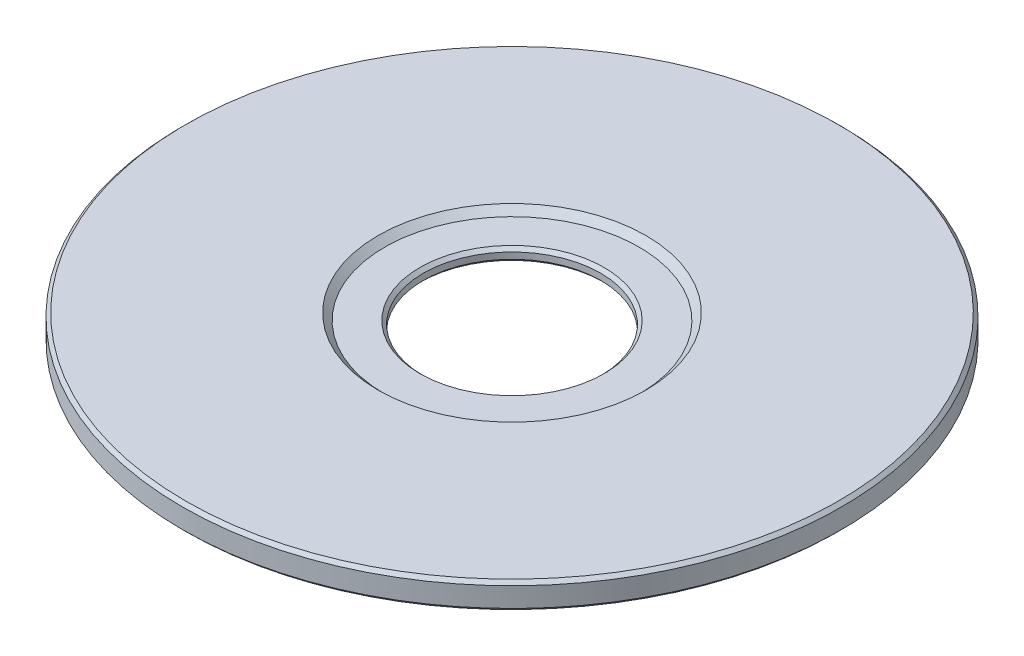
ISO-10303-21;
HEADER;
FILE_DESCRIPTION(('STEP AP214'),'2;1');
FILE_NAME('part.step','',(''),(''),'','','');
FILE_SCHEMA(('AUTOMOTIVE_DESIGN { 1 0 10303 214 1 1 1 1 }'));
ENDSEC;
DATA;
#1=APPLICATION_CONTEXT('core data for automotive mechanical design processes');
#2=APPLICATION_PROTOCOL_DEFINITION('international standard','automotive_design',2000,#1);
#3=PRODUCT_CONTEXT('',#1,'mechanical');
#4=PRODUCT('Part','Part','',(#3));
#5=PRODUCT_RELATED_PRODUCT_CATEGORY('part','',(#4));
#6=PRODUCT_DEFINITION_FORMATION('','',#4);
#7=PRODUCT_DEFINITION_CONTEXT('part definition',#1,'design');
#8=PRODUCT_DEFINITION('design','',#6,#7);
#9=PRODUCT_DEFINITION_SHAPE('','',#8);
#10=(LENGTH_UNIT() NAMED_UNIT(*) SI_UNIT(.MILLI.,.METRE.));
#11=(NAMED_UNIT(*) PLANE_ANGLE_UNIT() SI_UNIT($,.RADIAN.));
#12=(NAMED_UNIT(*) SI_UNIT($,.STERADIAN.) SOLID_ANGLE_UNIT());
#13=UNCERTAINTY_MEASURE_WITH_UNIT(LENGTH_MEASURE(1.E-05),#10,'distance_accuracy_value','');
#14=(GEOMETRIC_REPRESENTATION_CONTEXT(3) GLOBAL_UNCERTAINTY_ASSIGNED_CONTEXT((#13)) GLOBAL_UNIT_ASSIGNED_CONTEXT((#10,
#11,#12)) REPRESENTATION_CONTEXT('',''));
#15=CARTESIAN_POINT('',(0.,0.,0.));
#16=DIRECTION('',(0.,0.,1.));
#17=DIRECTION('',(1.,0.,0.));
#18=AXIS2_PLACEMENT_3D('',#15,#16,#17);
#19=CARTESIAN_POINT('',(-9.41609649999009,24.8615657104215,-11.5821424097362));
#20=DIRECTION('',(0.,-1.,0.));
#21=DIRECTION('',(0.,0.,-1.));
#22=AXIS2_PLACEMENT_3D('',#19,#20,#21);
#23=CYLINDRICAL_SURFACE('',#22,12.5);
#24=CARTESIAN_POINT('',(-9.41609649999009,23.9885657104215,-11.5821424097362));
#25=DIRECTION('',(0.,1.,0.));
#26=DIRECTION('',(0.,0.,1.));
#27=AXIS2_PLACEMENT_3D('',#24,#25,#26);
#28=CIRCLE('',#27,12.5);
#29=CARTESIAN_POINT('',(-9.41609649999009,23.9885657104215,0.917857590263794));
#30=VERTEX_POINT('',#29);
#31=EDGE_CURVE('E29',#30,#30,#28,.T.);
#32=ORIENTED_EDGE('',*,*,#31,.T.);
#33=EDGE_LOOP('',(#32));
#34=FACE_BOUND('',#33,.T.);
#35=CARTESIAN_POINT('',(-9.41609649999009,24.7345657104215,-11.5821424097362));
#36=DIRECTION('',(0.,1.,0.));
#37=DIRECTION('',(0.,0.,1.));
#38=AXIS2_PLACEMENT_3D('',#35,#36,#37);
#39=CIRCLE('',#38,12.5);
#40=CARTESIAN_POINT('',(-9.41609649999009,24.7345657104215,0.917857590263794));
#41=VERTEX_POINT('',#40);
#42=EDGE_CURVE('E35',#41,#41,#39,.F.);
#43=ORIENTED_EDGE('',*,*,#42,.T.);
#44=EDGE_LOOP('',(#43));
#45=FACE_BOUND('',#44,.T.);
#46=ADVANCED_FACE('F14',(#34,#45),#23,.T.);
#47=CARTESIAN_POINT('',(-9.41609649999009,24.8615657104215,-11.5821424097362));
#48=DIRECTION('',(0.,1.,0.));
#49=DIRECTION('',(0.,0.,1.));
#50=AXIS2_PLACEMENT_3D('',#47,#48,#49);
#51=PLANE('',#50);
#52=CARTESIAN_POINT('',(-9.41609649999009,24.8615657104215,-11.5821424097362));
#53=DIRECTION('',(0.,1.,0.));
#54=DIRECTION('',(0.,0.,1.));
#55=AXIS2_PLACEMENT_3D('',#52,#53,#54);
#56=CIRCLE('',#55,12.373);
#57=CARTESIAN_POINT('',(-9.41609649999009,24.8615657104215,0.790857590263788));
#58=VERTEX_POINT('',#57);
#59=EDGE_CURVE('E10',#58,#58,#56,.T.);
#60=ORIENTED_EDGE('',*,*,#59,.T.);
#61=EDGE_LOOP('',(#60));
#62=FACE_BOUND('',#61,.T.);
#63=CARTESIAN_POINT('',(-9.41609649999009,24.8615657104215,-11.5821424097362));
#64=DIRECTION('',(0.,1.,0.));
#65=DIRECTION('',(0.,0.,1.));
#66=AXIS2_PLACEMENT_3D('',#63,#64,#65);
#67=CIRCLE('',#66,5.08);
#68=CARTESIAN_POINT('',(-9.41609649999009,24.8615657104215,-6.50214240973621));
#69=VERTEX_POINT('',#68);
#70=EDGE_CURVE('E69',#69,#69,#67,.T.);
#71=ORIENTED_EDGE('',*,*,#70,.F.);
#72=EDGE_LOOP('',(#71));
#73=FACE_BOUND('',#72,.T.);
#74=ADVANCED_FACE('F78',(#62,#73),#51,.T.);
#75=CARTESIAN_POINT('',(-9.41609649999009,23.8615657104215,-11.5821424097362));
#76=DIRECTION('',(0.,1.,0.));
#77=DIRECTION('',(0.,0.,1.));
#78=AXIS2_PLACEMENT_3D('',#75,#76,#77);
#79=PLANE('',#78);
#80=CARTESIAN_POINT('',(-9.41609649999009,23.8615657104215,-11.5821424097362));
#81=DIRECTION('',(0.,1.,0.));
#82=DIRECTION('',(0.,0.,1.));
#83=AXIS2_PLACEMENT_3D('',#80,#81,#82);
#84=CIRCLE('',#83,12.373);
#85=CARTESIAN_POINT('',(-9.41609649999009,23.8615657104215,0.790857590263793));
#86=VERTEX_POINT('',#85);
#87=EDGE_CURVE('E22',#86,#86,#84,.F.);
#88=ORIENTED_EDGE('',*,*,#87,.T.);
#89=EDGE_LOOP('',(#88));
#90=FACE_BOUND('',#89,.T.);
#91=CARTESIAN_POINT('',(-9.41609649999009,23.8615657104215,-11.5821424097362));
#92=DIRECTION('',(0.,-1.,0.));
#93=DIRECTION('',(0.,0.,-1.));
#94=AXIS2_PLACEMENT_3D('',#91,#92,#93);
#95=CIRCLE('',#94,5.08);
#96=CARTESIAN_POINT('',(-9.41609649999009,23.8615657104215,-16.6621424097362));
#97=VERTEX_POINT('',#96);
#98=EDGE_CURVE('E65',#97,#97,#95,.T.);
#99=ORIENTED_EDGE('',*,*,#98,.F.);
#100=EDGE_LOOP('',(#99));
#101=FACE_BOUND('',#100,.T.);
#102=ADVANCED_FACE('F80',(#90,#101),#79,.F.);
#103=CARTESIAN_POINT('',(-9.41609649999009,24.1155657104215,-11.5821424097362));
#104=DIRECTION('',(0.,-1.,0.));
#105=DIRECTION('',(0.,0.,-1.));
#106=AXIS2_PLACEMENT_3D('',#103,#104,#105);
#107=PLANE('',#106);
#108=CARTESIAN_POINT('',(-9.41609649999009,24.1155657104215,-11.5821424097362));
#109=DIRECTION('',(0.,-1.,0.));
#110=DIRECTION('',(0.,0.,-1.));
#111=AXIS2_PLACEMENT_3D('',#108,#109,#110);
#112=CIRCLE('',#111,3.49250000000002);
#113=CARTESIAN_POINT('',(-9.41609649999009,24.1155657104215,-15.0746424097362));
#114=VERTEX_POINT('',#113);
#115=EDGE_CURVE('E41',#114,#114,#112,.F.);
#116=ORIENTED_EDGE('',*,*,#115,.T.);
#117=EDGE_LOOP('',(#116));
#118=FACE_BOUND('',#117,.T.);
#119=CARTESIAN_POINT('',(-9.41609649999009,24.1155657104215,-11.5821424097362));
#120=DIRECTION('',(0.,-1.,0.));
#121=DIRECTION('',(0.,0.,-1.));
#122=AXIS2_PLACEMENT_3D('',#119,#120,#121);
#123=CIRCLE('',#122,4.826);
#124=CARTESIAN_POINT('',(-9.41609649999009,24.1155657104215,-16.4081424097362));
#125=VERTEX_POINT('',#124);
#126=EDGE_CURVE('E57',#125,#125,#123,.T.);
#127=ORIENTED_EDGE('',*,*,#126,.T.);
#128=EDGE_LOOP('',(#127));
#129=FACE_BOUND('',#128,.T.);
#130=ADVANCED_FACE('F87',(#118,#129),#107,.T.);
#131=CARTESIAN_POINT('',(-9.41609649999009,24.6075657104215,-11.5821424097362));
#132=DIRECTION('',(0.,1.,0.));
#133=DIRECTION('',(0.,0.,1.));
#134=AXIS2_PLACEMENT_3D('',#131,#132,#133);
#135=PLANE('',#134);
#136=CARTESIAN_POINT('',(-9.41609649999009,24.6075657104215,-11.5821424097362));
#137=DIRECTION('',(0.,1.,0.));
#138=DIRECTION('',(0.,0.,1.));
#139=AXIS2_PLACEMENT_3D('',#136,#137,#138);
#140=CIRCLE('',#139,3.49250000000001);
#141=CARTESIAN_POINT('',(-9.41609649999009,24.6075657104215,-8.08964240973619));
#142=VERTEX_POINT('',#141);
#143=EDGE_CURVE('E45',#142,#142,#140,.F.);
#144=ORIENTED_EDGE('',*,*,#143,.T.);
#145=EDGE_LOOP('',(#144));
#146=FACE_BOUND('',#145,.T.);
#147=CARTESIAN_POINT('',(-9.41609649999009,24.6075657104215,-11.5821424097362));
#148=DIRECTION('',(0.,1.,0.));
#149=DIRECTION('',(0.,0.,1.));
#150=AXIS2_PLACEMENT_3D('',#147,#148,#149);
#151=CIRCLE('',#150,4.826);
#152=CARTESIAN_POINT('',(-9.41609649999009,24.6075657104215,-6.75614240973621));
#153=VERTEX_POINT('',#152);
#154=EDGE_CURVE('E61',#153,#153,#151,.T.);
#155=ORIENTED_EDGE('',*,*,#154,.T.);
#156=EDGE_LOOP('',(#155));
#157=FACE_BOUND('',#156,.T.);
#158=ADVANCED_FACE('F97',(#146,#157),#135,.T.);
#159=CARTESIAN_POINT('',(-9.41609649999009,24.6075657104215,-11.5821424097362));
#160=DIRECTION('',(0.,1.,0.));
#161=DIRECTION('',(0.,0.,1.));
#162=AXIS2_PLACEMENT_3D('',#159,#160,#161);
#163=CONICAL_SURFACE('',#162,4.826,0.785398163397457);
#164=ORIENTED_EDGE('',*,*,#70,.T.);
#165=EDGE_LOOP('',(#164));
#166=FACE_BOUND('',#165,.T.);
#167=ORIENTED_EDGE('',*,*,#154,.F.);
#168=EDGE_LOOP('',(#167));
#169=FACE_BOUND('',#168,.T.);
#170=ADVANCED_FACE('F75',(#166,#169),#163,.F.);
#171=CARTESIAN_POINT('',(-9.41609649999009,24.1155657104215,-11.5821424097362));
#172=DIRECTION('',(0.,-1.,0.));
#173=DIRECTION('',(0.,0.,-1.));
#174=AXIS2_PLACEMENT_3D('',#171,#172,#173);
#175=CONICAL_SURFACE('',#174,4.826,0.785398163397457);
#176=ORIENTED_EDGE('',*,*,#98,.T.);
#177=EDGE_LOOP('',(#176));
#178=FACE_BOUND('',#177,.T.);
#179=ORIENTED_EDGE('',*,*,#126,.F.);
#180=EDGE_LOOP('',(#179));
#181=FACE_BOUND('',#180,.T.);
#182=ADVANCED_FACE('F96',(#178,#181),#175,.F.);
#183=CARTESIAN_POINT('',(-9.41609649999009,24.8615657104215,-11.5821424097362));
#184=DIRECTION('',(0.,-1.,0.));
#185=DIRECTION('',(0.,0.,-1.));
#186=AXIS2_PLACEMENT_3D('',#183,#184,#185);
#187=CYLINDRICAL_SURFACE('',#186,3.3655);
#188=CARTESIAN_POINT('',(-9.41609649999009,24.4805657104215,-11.5821424097362));
#189=DIRECTION('',(0.,1.,0.));
#190=DIRECTION('',(0.,0.,1.));
#191=AXIS2_PLACEMENT_3D('',#188,#189,#190);
#192=CIRCLE('',#191,3.3655);
#193=CARTESIAN_POINT('',(-9.41609649999009,24.4805657104215,-14.9476424097362));
#194=VERTEX_POINT('',#193);
#195=EDGE_CURVE('E49',#194,#194,#192,.T.);
#196=CARTESIAN_POINT('',(-9.41609649999009,24.2425657104215,-11.5821424097362));
#197=DIRECTION('',(0.,-1.,0.));
#198=DIRECTION('',(0.,0.,-1.));
#199=AXIS2_PLACEMENT_3D('',#196,#197,#198);
#200=CIRCLE('',#199,3.3655);
#201=CARTESIAN_POINT('',(-9.41609649999009,24.2425657104215,-14.9476424097362));
#202=VERTEX_POINT('',#201);
#203=EDGE_CURVE('E53',#202,#202,#200,.T.);
#204=CARTESIAN_POINT('',(-9.41609649999009,24.4805657104215,-14.9476424097362));
#205=CARTESIAN_POINT('',(-9.41609649999009,24.4780865437548,-14.9476424097362));
#206=CARTESIAN_POINT('',(-9.41609649999009,24.4756073770881,-14.9476424097362));
#207=CARTESIAN_POINT('',(-9.41609649999009,24.4706490437548,-14.9476424097362));
#208=CARTESIAN_POINT('',(-9.41609649999009,24.4681698770881,-14.9476424097362));
#209=CARTESIAN_POINT('',(-9.41609649999009,24.4632115437548,-14.9476424097362));
#210=CARTESIAN_POINT('',(-9.41609649999009,24.4607323770881,-14.9476424097362));
#211=CARTESIAN_POINT('',(-9.41609649999009,24.4557740437548,-14.9476424097362));
#212=CARTESIAN_POINT('',(-9.41609649999009,24.4532948770881,-14.9476424097362));
#213=CARTESIAN_POINT('',(-9.41609649999009,24.4483365437548,-14.9476424097362));
#214=CARTESIAN_POINT('',(-9.41609649999009,24.4458573770881,-14.9476424097362));
#215=CARTESIAN_POINT('',(-9.41609649999009,24.4408990437548,-14.9476424097362));
#216=CARTESIAN_POINT('',(-9.41609649999009,24.4384198770881,-14.9476424097362));
#217=CARTESIAN_POINT('',(-9.41609649999009,24.4334615437548,-14.9476424097362));
#218=CARTESIAN_POINT('',(-9.41609649999009,24.4309823770881,-14.9476424097362));
#219=CARTESIAN_POINT('',(-9.41609649999009,24.4260240437548,-14.9476424097362));
#220=CARTESIAN_POINT('',(-9.41609649999009,24.4235448770881,-14.9476424097362));
#221=CARTESIAN_POINT('',(-9.41609649999009,24.4185865437548,-14.9476424097362));
#222=CARTESIAN_POINT('',(-9.41609649999009,24.4161073770881,-14.9476424097362));
#223=CARTESIAN_POINT('',(-9.41609649999009,24.4111490437548,-14.9476424097362));
#224=CARTESIAN_POINT('',(-9.41609649999009,24.4086698770881,-14.9476424097362));
#225=CARTESIAN_POINT('',(-9.41609649999009,24.4037115437548,-14.9476424097362));
#226=CARTESIAN_POINT('',(-9.41609649999009,24.4012323770881,-14.9476424097362));
#227=CARTESIAN_POINT('',(-9.41609649999009,24.3962740437548,-14.9476424097362));
#228=CARTESIAN_POINT('',(-9.41609649999009,24.3937948770881,-14.9476424097362));
#229=CARTESIAN_POINT('',(-9.41609649999009,24.3888365437548,-14.9476424097362));
#230=CARTESIAN_POINT('',(-9.41609649999009,24.3863573770881,-14.9476424097362));
#231=CARTESIAN_POINT('',(-9.41609649999009,24.3813990437548,-14.9476424097362));
#232=CARTESIAN_POINT('',(-9.41609649999009,24.3789198770881,-14.9476424097362));
#233=CARTESIAN_POINT('',(-9.41609649999009,24.3739615437548,-14.9476424097362));
#234=CARTESIAN_POINT('',(-9.41609649999009,24.3714823770881,-14.9476424097362));
#235=CARTESIAN_POINT('',(-9.41609649999009,24.3665240437548,-14.9476424097362));
#236=CARTESIAN_POINT('',(-9.41609649999009,24.3640448770881,-14.9476424097362));
#237=CARTESIAN_POINT('',(-9.41609649999009,24.3590865437548,-14.9476424097362));
#238=CARTESIAN_POINT('',(-9.41609649999009,24.3566073770881,-14.9476424097362));
#239=CARTESIAN_POINT('',(-9.41609649999009,24.3516490437548,-14.9476424097362));
#240=CARTESIAN_POINT('',(-9.41609649999009,24.3491698770881,-14.9476424097362));
#241=CARTESIAN_POINT('',(-9.41609649999009,24.3442115437548,-14.9476424097362));
#242=CARTESIAN_POINT('',(-9.41609649999009,24.3417323770881,-14.9476424097362));
#243=CARTESIAN_POINT('',(-9.41609649999009,24.3367740437548,-14.9476424097362));
#244=CARTESIAN_POINT('',(-9.41609649999009,24.3342948770882,-14.9476424097362));
#245=CARTESIAN_POINT('',(-9.41609649999009,24.3293365437548,-14.9476424097362));
#246=CARTESIAN_POINT('',(-9.41609649999009,24.3268573770882,-14.9476424097362));
#247=CARTESIAN_POINT('',(-9.41609649999009,24.3218990437548,-14.9476424097362));
#248=CARTESIAN_POINT('',(-9.41609649999009,24.3194198770882,-14.9476424097362));
#249=CARTESIAN_POINT('',(-9.41609649999009,24.3144615437548,-14.9476424097362));
#250=CARTESIAN_POINT('',(-9.41609649999009,24.3119823770882,-14.9476424097362));
#251=CARTESIAN_POINT('',(-9.41609649999009,24.3070240437548,-14.9476424097362));
#252=CARTESIAN_POINT('',(-9.41609649999009,24.3045448770882,-14.9476424097362));
#253=CARTESIAN_POINT('',(-9.41609649999009,24.2995865437548,-14.9476424097362));
#254=CARTESIAN_POINT('',(-9.41609649999009,24.2971073770882,-14.9476424097362));
#255=CARTESIAN_POINT('',(-9.41609649999009,24.2921490437548,-14.9476424097362));
#256=CARTESIAN_POINT('',(-9.41609649999009,24.2896698770882,-14.9476424097362));
#257=CARTESIAN_POINT('',(-9.41609649999009,24.2847115437548,-14.9476424097362));
#258=CARTESIAN_POINT('',(-9.41609649999009,24.2822323770882,-14.9476424097362));
#259=CARTESIAN_POINT('',(-9.41609649999009,24.2772740437548,-14.9476424097362));
#260=CARTESIAN_POINT('',(-9.41609649999009,24.2747948770882,-14.9476424097362));
#261=CARTESIAN_POINT('',(-9.41609649999009,24.2698365437548,-14.9476424097362));
#262=CARTESIAN_POINT('',(-9.41609649999009,24.2673573770882,-14.9476424097362));
#263=CARTESIAN_POINT('',(-9.41609649999009,24.2623990437548,-14.9476424097362));
#264=CARTESIAN_POINT('',(-9.41609649999009,24.2599198770882,-14.9476424097362));
#265=CARTESIAN_POINT('',(-9.41609649999009,24.2549615437548,-14.9476424097362));
#266=CARTESIAN_POINT('',(-9.41609649999009,24.2524823770882,-14.9476424097362));
#267=CARTESIAN_POINT('',(-9.41609649999009,24.2475240437548,-14.9476424097362));
#268=CARTESIAN_POINT('',(-9.41609649999009,24.2450448770882,-14.9476424097362));
#269=CARTESIAN_POINT('',(-9.41609649999009,24.2425657104215,-14.9476424097362));
#270=B_SPLINE_CURVE_WITH_KNOTS('',3,(#204,#205,#206,#207,#208,#209,#210,#211,#212,#213,#214,
#215,#216,#217,#218,#219,#220,#221,#222,#223,#224,#225,#226,#227,#228,#229,#230,#231,#232,#233,
#234,#235,#236,#237,#238,#239,#240,#241,#242,#243,#244,#245,#246,#247,#248,#249,#250,#251,#252,
#253,#254,#255,#256,#257,#258,#259,#260,#261,#262,#263,#264,#265,#266,#267,#268,#269),
.UNSPECIFIED.,.F.,.F.,(4,2,2,2,2,2,2,2,2,2,2,2,2,2,2,2,2,2,2,2,2,2,2,2,2,2,2,2,2,2,2,2,4),(0.,
0.00743750000000223,0.014875000000001,0.0223124999999998,0.0297499999999985,0.0371874999999973,
0.0446249999999961,0.0520624999999948,0.0594999999999936,0.0669374999999924,0.0743749999999911,
0.0818124999999899,0.0892499999999886,0.0966874999999874,0.104124999999986,0.111562499999985,
0.118999999999984,0.126437499999982,0.133874999999981,0.14131249999998,0.148749999999979,
0.156187499999978,0.163624999999976,0.171062499999975,0.178499999999974,0.185937499999973,
0.193374999999971,0.20081249999997,0.208249999999969,0.215687499999968,0.223124999999966,
0.230562499999965,0.237999999999967),.UNSPECIFIED.);
#271=EDGE_CURVE('BSEAM100',#194,#202,#270,.T.);
#272=ORIENTED_EDGE('',*,*,#195,.T.);
#273=ORIENTED_EDGE('',*,*,#203,.T.);
#274=ORIENTED_EDGE('',*,*,#271,.T.);
#275=ORIENTED_EDGE('',*,*,#271,.F.);
#276=EDGE_LOOP('',(#272,#274,#273,#275));
#277=FACE_BOUND('',#276,.T.);
#278=ADVANCED_FACE('F100',(#277),#187,.F.);
#279=CARTESIAN_POINT('',(-9.41609649999009,24.4805657104215,-11.5821424097362));
#280=DIRECTION('',(0.,1.,0.));
#281=DIRECTION('',(0.,0.,1.));
#282=AXIS2_PLACEMENT_3D('',#279,#280,#281);
#283=CONICAL_SURFACE('',#282,3.3655,0.785398163397459);
#284=ORIENTED_EDGE('',*,*,#143,.F.);
#285=EDGE_LOOP('',(#284));
#286=FACE_BOUND('',#285,.T.);
#287=ORIENTED_EDGE('',*,*,#195,.F.);
#288=EDGE_LOOP('',(#287));
#289=FACE_BOUND('',#288,.T.);
#290=ADVANCED_FACE('F102',(#286,#289),#283,.F.);
#291=CARTESIAN_POINT('',(-9.41609649999009,24.2425657104215,-11.5821424097362));
#292=DIRECTION('',(0.,-1.,0.));
#293=DIRECTION('',(0.,0.,-1.));
#294=AXIS2_PLACEMENT_3D('',#291,#292,#293);
#295=CONICAL_SURFACE('',#294,3.3655,0.785398163397438);
#296=ORIENTED_EDGE('',*,*,#115,.F.);
#297=EDGE_LOOP('',(#296));
#298=FACE_BOUND('',#297,.T.);
#299=ORIENTED_EDGE('',*,*,#203,.F.);
#300=EDGE_LOOP('',(#299));
#301=FACE_BOUND('',#300,.T.);
#302=ADVANCED_FACE('F105',(#298,#301),#295,.F.);
#303=CARTESIAN_POINT('',(-9.41609649999009,23.9885657104215,-11.5821424097362));
#304=DIRECTION('',(0.,1.,0.));
#305=DIRECTION('',(0.,0.,1.));
#306=AXIS2_PLACEMENT_3D('',#303,#304,#305);
#307=CONICAL_SURFACE('',#306,12.5,0.785398163397455);
#308=ORIENTED_EDGE('',*,*,#87,.F.);
#309=EDGE_LOOP('',(#308));
#310=FACE_BOUND('',#309,.T.);
#311=ORIENTED_EDGE('',*,*,#31,.F.);
#312=EDGE_LOOP('',(#311));
#313=FACE_BOUND('',#312,.T.);
#314=ADVANCED_FACE('F108',(#310,#313),#307,.T.);
#315=CARTESIAN_POINT('',(-9.41609649999009,24.8615657104215,-11.5821424097362));
#316=DIRECTION('',(0.,-1.,0.));
#317=DIRECTION('',(0.,0.,-1.));
#318=AXIS2_PLACEMENT_3D('',#315,#316,#317);
#319=CONICAL_SURFACE('',#318,12.373,0.785398163397469);
#320=ORIENTED_EDGE('',*,*,#42,.F.);
#321=EDGE_LOOP('',(#320));
#322=FACE_BOUND('',#321,.T.);
#323=ORIENTED_EDGE('',*,*,#59,.F.);
#324=EDGE_LOOP('',(#323));
#325=FACE_BOUND('',#324,.T.);
#326=ADVANCED_FACE('F16',(#322,#325),#319,.T.);
#327=CLOSED_SHELL('',(#46,#74,#102,#130,#158,#170,#182,#278,#290,#302,#314,#326));
#328=MANIFOLD_SOLID_BREP('B1',#327);
#329=ADVANCED_BREP_SHAPE_REPRESENTATION('',(#18,#328),#14);
#330=SHAPE_DEFINITION_REPRESENTATION(#9,#329);
ENDSEC;
END-ISO-10303-21;
